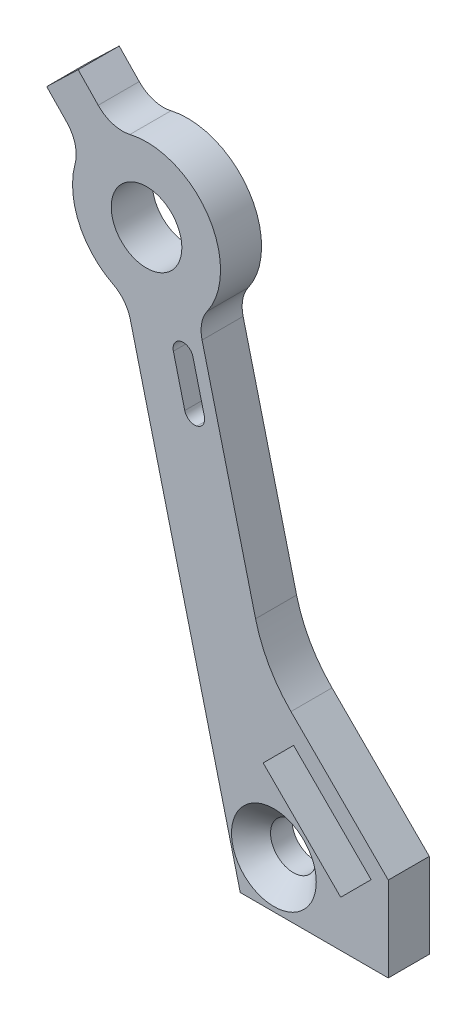
ISO-10303-21;
HEADER;
FILE_DESCRIPTION(('STEP AP214'),'2;1');
FILE_NAME('part.step','',(''),(''),'','','');
FILE_SCHEMA(('AUTOMOTIVE_DESIGN { 1 0 10303 214 1 1 1 1 }'));
ENDSEC;
DATA;
#1=APPLICATION_CONTEXT('core data for automotive mechanical design processes');
#2=APPLICATION_PROTOCOL_DEFINITION('international standard','automotive_design',2000,#1);
#3=PRODUCT_CONTEXT('',#1,'mechanical');
#4=PRODUCT('Part','Part','',(#3));
#5=PRODUCT_RELATED_PRODUCT_CATEGORY('part','',(#4));
#6=PRODUCT_DEFINITION_FORMATION('','',#4);
#7=PRODUCT_DEFINITION_CONTEXT('part definition',#1,'design');
#8=PRODUCT_DEFINITION('design','',#6,#7);
#9=PRODUCT_DEFINITION_SHAPE('','',#8);
#10=(LENGTH_UNIT() NAMED_UNIT(*) SI_UNIT(.MILLI.,.METRE.));
#11=(NAMED_UNIT(*) PLANE_ANGLE_UNIT() SI_UNIT($,.RADIAN.));
#12=(NAMED_UNIT(*) SI_UNIT($,.STERADIAN.) SOLID_ANGLE_UNIT());
#13=UNCERTAINTY_MEASURE_WITH_UNIT(LENGTH_MEASURE(1.E-05),#10,'distance_accuracy_value','');
#14=(GEOMETRIC_REPRESENTATION_CONTEXT(3) GLOBAL_UNCERTAINTY_ASSIGNED_CONTEXT((#13)) GLOBAL_UNIT_ASSIGNED_CONTEXT((#10,
#11,#12)) REPRESENTATION_CONTEXT('',''));
#15=CARTESIAN_POINT('',(0.,0.,0.));
#16=DIRECTION('',(0.,0.,1.));
#17=DIRECTION('',(1.,0.,0.));
#18=AXIS2_PLACEMENT_3D('',#15,#16,#17);
#19=CARTESIAN_POINT('',(4.36654034065617,1.08780763622181,3.05));
#20=DIRECTION('',(-0.970342297923589,-0.241735030271512,0.));
#21=DIRECTION('',(0.241735030271512,-0.970342297923589,0.));
#22=AXIS2_PLACEMENT_3D('',#19,#20,#21);
#23=PLANE('',#22);
#24=DIRECTION('',(-0.241735030271512,0.970342297923589,0.));
#25=VECTOR('',#24,1.);
#26=CARTESIAN_POINT('',(4.36654034065617,1.08780763622181,0.));
#27=LINE('',#26,#25);
#28=CARTESIAN_POINT('',(-2.66788839228542,29.3245250604018,0.));
#29=VERTEX_POINT('',#28);
#30=CARTESIAN_POINT('',(-3.51396099823572,32.7207231031344,0.));
#31=VERTEX_POINT('',#30);
#32=EDGE_CURVE('E345',#29,#31,#27,.T.);
#33=ORIENTED_EDGE('',*,*,#32,.F.);
#34=DIRECTION('',(0.,0.,-1.));
#35=VECTOR('',#34,1.);
#36=CARTESIAN_POINT('',(-2.66788839228542,29.3245250604018,3.05));
#37=LINE('',#36,#35);
#38=CARTESIAN_POINT('',(-2.66788839228542,29.3245250604018,3.05));
#39=VERTEX_POINT('',#38);
#40=EDGE_CURVE('E444',#29,#39,#37,.F.);
#41=ORIENTED_EDGE('',*,*,#40,.T.);
#42=DIRECTION('',(-0.241735030271512,0.970342297923589,0.));
#43=VECTOR('',#42,1.);
#44=CARTESIAN_POINT('',(4.36654034065617,1.08780763622181,3.05));
#45=LINE('',#44,#43);
#46=CARTESIAN_POINT('',(-3.51396099823572,32.7207231031344,3.05));
#47=VERTEX_POINT('',#46);
#48=EDGE_CURVE('E284',#39,#47,#45,.T.);
#49=ORIENTED_EDGE('',*,*,#48,.T.);
#50=DIRECTION('',(0.,0.,-1.));
#51=VECTOR('',#50,1.);
#52=CARTESIAN_POINT('',(-3.51396099823572,32.7207231031344,0.));
#53=LINE('',#52,#51);
#54=EDGE_CURVE('E440',#47,#31,#53,.T.);
#55=ORIENTED_EDGE('',*,*,#54,.T.);
#56=EDGE_LOOP('',(#33,#41,#49,#55));
#57=FACE_BOUND('',#56,.T.);
#58=ADVANCED_FACE('F45',(#57),#23,.T.);
#59=CARTESIAN_POINT('',(7.70970869120796,7.70970869120796,3.05));
#60=DIRECTION('',(0.707106781186548,0.707106781186547,0.));
#61=DIRECTION('',(-0.707106781186547,0.707106781186548,0.));
#62=AXIS2_PLACEMENT_3D('',#59,#60,#61);
#63=PLANE('',#62);
#64=DIRECTION('',(0.707106781186547,-0.707106781186548,0.));
#65=VECTOR('',#64,1.);
#66=CARTESIAN_POINT('',(7.70970869120796,7.70970869120796,0.));
#67=LINE('',#66,#65);
#68=CARTESIAN_POINT('',(3.96428752719385,11.4551298552221,0.));
#69=VERTEX_POINT('',#68);
#70=CARTESIAN_POINT('',(9.72720779386421,5.6922095885517,0.));
#71=VERTEX_POINT('',#70);
#72=EDGE_CURVE('E331',#69,#71,#67,.T.);
#73=ORIENTED_EDGE('',*,*,#72,.T.);
#74=DIRECTION('',(0.,0.,-1.));
#75=VECTOR('',#74,1.);
#76=CARTESIAN_POINT('',(9.72720779386421,5.6922095885517,3.05));
#77=LINE('',#76,#75);
#78=CARTESIAN_POINT('',(9.72720779386421,5.6922095885517,3.05));
#79=VERTEX_POINT('',#78);
#80=EDGE_CURVE('E363',#79,#71,#77,.T.);
#81=ORIENTED_EDGE('',*,*,#80,.F.);
#82=DIRECTION('',(0.707106781186547,-0.707106781186548,0.));
#83=VECTOR('',#82,1.);
#84=CARTESIAN_POINT('',(7.70970869120796,7.70970869120796,3.05));
#85=LINE('',#84,#83);
#86=CARTESIAN_POINT('',(3.96428752719385,11.4551298552221,3.05));
#87=VERTEX_POINT('',#86);
#88=EDGE_CURVE('E271',#87,#79,#85,.T.);
#89=ORIENTED_EDGE('',*,*,#88,.F.);
#90=DIRECTION('',(0.,0.,-1.));
#91=VECTOR('',#90,1.);
#92=CARTESIAN_POINT('',(3.96428752719385,11.4551298552221,3.05));
#93=LINE('',#92,#91);
#94=EDGE_CURVE('E227',#87,#69,#93,.T.);
#95=ORIENTED_EDGE('',*,*,#94,.T.);
#96=EDGE_LOOP('',(#73,#81,#89,#95));
#97=FACE_BOUND('',#96,.T.);
#98=ADVANCED_FACE('F521',(#97),#63,.F.);
#99=CARTESIAN_POINT('',(2.01749910265625,-2.01749910265625,3.05));
#100=DIRECTION('',(-0.707106781186547,0.707106781186548,0.));
#101=DIRECTION('',(-0.707106781186548,-0.707106781186547,0.));
#102=AXIS2_PLACEMENT_3D('',#99,#100,#101);
#103=PLANE('',#102);
#104=DIRECTION('',(0.707106781186548,0.707106781186547,0.));
#105=VECTOR('',#104,1.);
#106=CARTESIAN_POINT('',(2.01749910265625,-2.01749910265625,0.));
#107=LINE('',#106,#105);
#108=CARTESIAN_POINT('',(7.46446609406726,3.42946788875475,0.));
#109=VERTEX_POINT('',#108);
#110=EDGE_CURVE('E335',#109,#71,#107,.T.);
#111=ORIENTED_EDGE('',*,*,#110,.F.);
#112=DIRECTION('',(0.,0.,-1.));
#113=VECTOR('',#112,1.);
#114=CARTESIAN_POINT('',(7.46446609406726,3.42946788875475,3.05));
#115=LINE('',#114,#113);
#116=CARTESIAN_POINT('',(7.46446609406726,3.42946788875475,3.05));
#117=VERTEX_POINT('',#116);
#118=EDGE_CURVE('E360',#117,#109,#115,.T.);
#119=ORIENTED_EDGE('',*,*,#118,.F.);
#120=DIRECTION('',(0.707106781186548,0.707106781186547,0.));
#121=VECTOR('',#120,1.);
#122=CARTESIAN_POINT('',(2.01749910265625,-2.01749910265625,3.05));
#123=LINE('',#122,#121);
#124=EDGE_CURVE('E274',#117,#79,#123,.T.);
#125=ORIENTED_EDGE('',*,*,#124,.T.);
#126=ORIENTED_EDGE('',*,*,#80,.T.);
#127=EDGE_LOOP('',(#111,#119,#125,#126));
#128=FACE_BOUND('',#127,.T.);
#129=ADVANCED_FACE('F526',(#128),#103,.T.);
#130=CARTESIAN_POINT('',(5.44696699141101,5.44696699141101,3.05));
#131=DIRECTION('',(-0.707106781186548,-0.707106781186548,0.));
#132=DIRECTION('',(0.707106781186548,-0.707106781186548,0.));
#133=AXIS2_PLACEMENT_3D('',#130,#131,#132);
#134=PLANE('',#133);
#135=DIRECTION('',(-0.707106781186548,0.707106781186548,0.));
#136=VECTOR('',#135,1.);
#137=CARTESIAN_POINT('',(5.44696699141101,5.44696699141101,0.));
#138=LINE('',#137,#136);
#139=CARTESIAN_POINT('',(1.70154582739689,9.19238815542512,0.));
#140=VERTEX_POINT('',#139);
#141=EDGE_CURVE('E339',#109,#140,#138,.T.);
#142=ORIENTED_EDGE('',*,*,#141,.T.);
#143=DIRECTION('',(0.,0.,-1.));
#144=VECTOR('',#143,1.);
#145=CARTESIAN_POINT('',(1.70154582739689,9.19238815542512,3.05));
#146=LINE('',#145,#144);
#147=CARTESIAN_POINT('',(1.70154582739689,9.19238815542512,3.05));
#148=VERTEX_POINT('',#147);
#149=EDGE_CURVE('E356',#148,#140,#146,.T.);
#150=ORIENTED_EDGE('',*,*,#149,.F.);
#151=DIRECTION('',(-0.707106781186548,0.707106781186548,0.));
#152=VECTOR('',#151,1.);
#153=CARTESIAN_POINT('',(5.44696699141101,5.44696699141101,3.05));
#154=LINE('',#153,#152);
#155=EDGE_CURVE('E278',#117,#148,#154,.T.);
#156=ORIENTED_EDGE('',*,*,#155,.F.);
#157=ORIENTED_EDGE('',*,*,#118,.T.);
#158=EDGE_LOOP('',(#142,#150,#156,#157));
#159=FACE_BOUND('',#158,.T.);
#160=ADVANCED_FACE('F536',(#159),#134,.F.);
#161=CARTESIAN_POINT('',(-6.96463898907044,39.3326684601052,3.05));
#162=DIRECTION('',(0.,0.,-1.));
#163=DIRECTION('',(-1.,0.,0.));
#164=AXIS2_PLACEMENT_3D('',#161,#162,#163);
#165=CYLINDRICAL_SURFACE('',#164,5.5);
#166=CARTESIAN_POINT('',(-6.96463898907044,39.3326684601052,0.));
#167=DIRECTION('',(0.,0.,1.));
#168=DIRECTION('',(1.,0.,0.));
#169=AXIS2_PLACEMENT_3D('',#166,#167,#168);
#170=CIRCLE('',#169,5.5);
#171=CARTESIAN_POINT('',(-2.45911194166731,36.1782705738013,0.));
#172=VERTEX_POINT('',#171);
#173=CARTESIAN_POINT('',(-8.19716703361366,44.6927873598513,0.));
#174=VERTEX_POINT('',#173);
#175=EDGE_CURVE('E297',#172,#174,#170,.T.);
#176=ORIENTED_EDGE('',*,*,#175,.T.);
#177=DIRECTION('',(0.,0.,-1.));
#178=VECTOR('',#177,1.);
#179=CARTESIAN_POINT('',(-8.19716703361366,44.6927873598513,3.05));
#180=LINE('',#179,#178);
#181=CARTESIAN_POINT('',(-8.19716703361366,44.6927873598513,3.05));
#182=VERTEX_POINT('',#181);
#183=EDGE_CURVE('E384',#174,#182,#180,.F.);
#184=ORIENTED_EDGE('',*,*,#183,.T.);
#185=CARTESIAN_POINT('',(-6.96463898907044,39.3326684601052,3.05));
#186=DIRECTION('',(0.,0.,1.));
#187=DIRECTION('',(1.,0.,0.));
#188=AXIS2_PLACEMENT_3D('',#185,#186,#187);
#189=CIRCLE('',#188,5.5);
#190=CARTESIAN_POINT('',(-2.45911194166731,36.1782705738013,3.05));
#191=VERTEX_POINT('',#190);
#192=EDGE_CURVE('E241',#191,#182,#189,.T.);
#193=ORIENTED_EDGE('',*,*,#192,.F.);
#194=DIRECTION('',(0.,0.,-1.));
#195=VECTOR('',#194,1.);
#196=CARTESIAN_POINT('',(-2.45911194166731,36.1782705738013,3.05));
#197=LINE('',#196,#195);
#198=EDGE_CURVE('E380',#191,#172,#197,.T.);
#199=ORIENTED_EDGE('',*,*,#198,.T.);
#200=EDGE_LOOP('',(#176,#184,#193,#199));
#201=FACE_BOUND('',#200,.T.);
#202=ADVANCED_FACE('F539',(#201),#165,.T.);
#203=CARTESIAN_POINT('',(17.2180416361221,16.6208626165362,3.05));
#204=DIRECTION('',(0.719473565232645,0.694519826161519,0.));
#205=DIRECTION('',(-0.694519826161519,0.719473565232645,0.));
#206=AXIS2_PLACEMENT_3D('',#203,#204,#205);
#207=PLANE('',#206);
#208=DIRECTION('',(0.694519826161519,-0.719473565232645,0.));
#209=VECTOR('',#208,1.);
#210=CARTESIAN_POINT('',(17.2180416361221,16.6208626165362,3.05));
#211=LINE('',#210,#209);
#212=CARTESIAN_POINT('',(-12.0461728810211,46.9365252647115,3.05));
#213=VERTEX_POINT('',#212);
#214=CARTESIAN_POINT('',(-10.5560909669422,45.3929054761502,3.05));
#215=VERTEX_POINT('',#214);
#216=EDGE_CURVE('E218',#213,#215,#211,.T.);
#217=ORIENTED_EDGE('',*,*,#216,.T.);
#218=DIRECTION('',(0.,0.,-1.));
#219=VECTOR('',#218,1.);
#220=CARTESIAN_POINT('',(-10.5560909669422,45.3929054761502,3.05));
#221=LINE('',#220,#219);
#222=CARTESIAN_POINT('',(-10.5560909669422,45.3929054761502,0.));
#223=VERTEX_POINT('',#222);
#224=EDGE_CURVE('E366',#215,#223,#221,.T.);
#225=ORIENTED_EDGE('',*,*,#224,.T.);
#226=DIRECTION('',(0.694519826161519,-0.719473565232645,0.));
#227=VECTOR('',#226,1.);
#228=CARTESIAN_POINT('',(17.2180416361221,16.6208626165362,0.));
#229=LINE('',#228,#227);
#230=CARTESIAN_POINT('',(-12.0461728810211,46.9365252647115,0.));
#231=VERTEX_POINT('',#230);
#232=EDGE_CURVE('E221',#231,#223,#229,.T.);
#233=ORIENTED_EDGE('',*,*,#232,.F.);
#234=DIRECTION('',(0.,0.,-1.));
#235=VECTOR('',#234,1.);
#236=CARTESIAN_POINT('',(-12.0461728810211,46.9365252647115,3.05));
#237=LINE('',#236,#235);
#238=EDGE_CURVE('E214',#213,#231,#237,.T.);
#239=ORIENTED_EDGE('',*,*,#238,.F.);
#240=EDGE_LOOP('',(#217,#225,#233,#239));
#241=FACE_BOUND('',#240,.T.);
#242=ADVANCED_FACE('F216',(#241),#207,.T.);
#243=CARTESIAN_POINT('',(-29.2642145171432,30.3156626481751,3.05));
#244=DIRECTION('',(-0.694519826161522,0.719473565232643,0.));
#245=DIRECTION('',(-0.719473565232643,-0.694519826161522,0.));
#246=AXIS2_PLACEMENT_3D('',#243,#244,#245);
#247=PLANE('',#246);
#248=DIRECTION('',(0.719473565232643,0.694519826161522,0.));
#249=VECTOR('',#248,1.);
#250=CARTESIAN_POINT('',(-29.2642145171432,30.3156626481751,0.));
#251=LINE('',#250,#249);
#252=CARTESIAN_POINT('',(-14.3844619680272,44.6793358296865,0.));
#253=VERTEX_POINT('',#252);
#254=EDGE_CURVE('E307',#253,#231,#251,.T.);
#255=ORIENTED_EDGE('',*,*,#254,.F.);
#256=DIRECTION('',(0.,0.,-1.));
#257=VECTOR('',#256,1.);
#258=CARTESIAN_POINT('',(-14.3844619680272,44.6793358296865,3.05));
#259=LINE('',#258,#257);
#260=CARTESIAN_POINT('',(-14.3844619680272,44.6793358296865,3.05));
#261=VERTEX_POINT('',#260);
#262=EDGE_CURVE('E228',#261,#253,#259,.T.);
#263=ORIENTED_EDGE('',*,*,#262,.F.);
#264=DIRECTION('',(0.719473565232643,0.694519826161522,0.));
#265=VECTOR('',#264,1.);
#266=CARTESIAN_POINT('',(-29.2642145171432,30.3156626481751,3.05));
#267=LINE('',#266,#265);
#268=EDGE_CURVE('E236',#261,#213,#267,.T.);
#269=ORIENTED_EDGE('',*,*,#268,.T.);
#270=ORIENTED_EDGE('',*,*,#238,.T.);
#271=EDGE_LOOP('',(#255,#263,#269,#270));
#272=FACE_BOUND('',#271,.T.);
#273=ADVANCED_FACE('F243',(#272),#247,.T.);
#274=CARTESIAN_POINT('',(14.8797525491159,14.3636731815112,3.05));
#275=DIRECTION('',(0.719473565232646,0.694519826161518,0.));
#276=DIRECTION('',(-0.694519826161518,0.719473565232646,0.));
#277=AXIS2_PLACEMENT_3D('',#274,#275,#276);
#278=PLANE('',#277);
#279=DIRECTION('',(0.694519826161518,-0.719473565232647,0.));
#280=VECTOR('',#279,1.);
#281=CARTESIAN_POINT('',(14.8797525491159,14.3636731815112,0.));
#282=LINE('',#281,#280);
#283=CARTESIAN_POINT('',(-12.8943800539482,43.1357160411252,0.));
#284=VERTEX_POINT('',#283);
#285=EDGE_CURVE('E304',#253,#284,#282,.T.);
#286=ORIENTED_EDGE('',*,*,#285,.T.);
#287=DIRECTION('',(0.,0.,1.));
#288=VECTOR('',#287,1.);
#289=CARTESIAN_POINT('',(-12.8943800539482,43.1357160411252,3.05));
#290=LINE('',#289,#288);
#291=CARTESIAN_POINT('',(-12.8943800539482,43.1357160411252,3.05));
#292=VERTEX_POINT('',#291);
#293=EDGE_CURVE('E394',#284,#292,#290,.T.);
#294=ORIENTED_EDGE('',*,*,#293,.T.);
#295=DIRECTION('',(0.694519826161518,-0.719473565232647,0.));
#296=VECTOR('',#295,1.);
#297=CARTESIAN_POINT('',(14.8797525491159,14.3636731815112,3.05));
#298=LINE('',#297,#296);
#299=EDGE_CURVE('E246',#261,#292,#298,.T.);
#300=ORIENTED_EDGE('',*,*,#299,.F.);
#301=ORIENTED_EDGE('',*,*,#262,.T.);
#302=EDGE_LOOP('',(#286,#294,#300,#301));
#303=FACE_BOUND('',#302,.T.);
#304=ADVANCED_FACE('F565',(#303),#278,.F.);
#305=CARTESIAN_POINT('',(-12.2779311614175,40.7535577208413,3.05));
#306=VERTEX_POINT('',#305);
#307=CARTESIAN_POINT('',(-9.4637704048032,34.4332458240289,3.05));
#308=VERTEX_POINT('',#307);
#309=EDGE_CURVE('E249',#306,#308,#189,.T.);
#310=ORIENTED_EDGE('',*,*,#309,.F.);
#311=DIRECTION('',(0.,0.,-1.));
#312=VECTOR('',#311,1.);
#313=CARTESIAN_POINT('',(-12.2779311614175,40.7535577208413,3.05));
#314=LINE('',#313,#312);
#315=CARTESIAN_POINT('',(-12.2779311614175,40.7535577208413,0.));
#316=VERTEX_POINT('',#315);
#317=EDGE_CURVE('E390',#306,#316,#314,.T.);
#318=ORIENTED_EDGE('',*,*,#317,.T.);
#319=CARTESIAN_POINT('',(-9.4637704048032,34.4332458240289,0.));
#320=VERTEX_POINT('',#319);
#321=EDGE_CURVE('E299',#316,#320,#170,.T.);
#322=ORIENTED_EDGE('',*,*,#321,.T.);
#323=DIRECTION('',(0.,0.,-1.));
#324=VECTOR('',#323,1.);
#325=CARTESIAN_POINT('',(-9.4637704048032,34.4332458240289,3.05));
#326=LINE('',#325,#324);
#327=EDGE_CURVE('E387',#320,#308,#326,.F.);
#328=ORIENTED_EDGE('',*,*,#327,.T.);
#329=EDGE_LOOP('',(#310,#318,#322,#328));
#330=FACE_BOUND('',#329,.T.);
#331=ADVANCED_FACE('F561',(#330),#165,.T.);
#332=CARTESIAN_POINT('',(0.,0.,3.05));
#333=DIRECTION('',(-0.970342297923589,-0.241735030271511,0.));
#334=DIRECTION('',(0.241735030271511,-0.970342297923589,0.));
#335=AXIS2_PLACEMENT_3D('',#332,#333,#334);
#336=PLANE('',#335);
#337=DIRECTION('',(-0.241735030271511,0.970342297923589,0.));
#338=VECTOR('',#337,1.);
#339=CARTESIAN_POINT('',(0.,0.,3.05));
#340=LINE('',#339,#338);
#341=CARTESIAN_POINT('',(0.,0.,3.05));
#342=VERTEX_POINT('',#341);
#343=CARTESIAN_POINT('',(-8.17388348532729,32.810573110582,3.05));
#344=VERTEX_POINT('',#343);
#345=EDGE_CURVE('E253',#342,#344,#340,.T.);
#346=ORIENTED_EDGE('',*,*,#345,.T.);
#347=DIRECTION('',(0.,0.,-1.));
#348=VECTOR('',#347,1.);
#349=CARTESIAN_POINT('',(-8.17388348532729,32.810573110582,3.05));
#350=LINE('',#349,#348);
#351=CARTESIAN_POINT('',(-8.17388348532729,32.810573110582,0.));
#352=VERTEX_POINT('',#351);
#353=EDGE_CURVE('E397',#344,#352,#350,.T.);
#354=ORIENTED_EDGE('',*,*,#353,.T.);
#355=DIRECTION('',(-0.241735030271511,0.970342297923589,0.));
#356=VECTOR('',#355,1.);
#357=CARTESIAN_POINT('',(0.,0.,0.));
#358=LINE('',#357,#356);
#359=CARTESIAN_POINT('',(0.,0.,0.));
#360=VERTEX_POINT('',#359);
#361=EDGE_CURVE('E303',#360,#352,#358,.T.);
#362=ORIENTED_EDGE('',*,*,#361,.F.);
#363=DIRECTION('',(0.,0.,-1.));
#364=VECTOR('',#363,1.);
#365=CARTESIAN_POINT('',(0.,0.,3.05));
#366=LINE('',#365,#364);
#367=EDGE_CURVE('E373',#342,#360,#366,.T.);
#368=ORIENTED_EDGE('',*,*,#367,.F.);
#369=EDGE_LOOP('',(#346,#354,#362,#368));
#370=FACE_BOUND('',#369,.T.);
#371=ADVANCED_FACE('F557',(#370),#336,.T.);
#372=CARTESIAN_POINT('',(0.,0.,3.05));
#373=DIRECTION('',(0.,1.,0.));
#374=DIRECTION('',(-1.,0.,0.));
#375=AXIS2_PLACEMENT_3D('',#372,#373,#374);
#376=PLANE('',#375);
#377=DIRECTION('',(1.,0.,0.));
#378=VECTOR('',#377,1.);
#379=CARTESIAN_POINT('',(0.,0.,0.));
#380=LINE('',#379,#378);
#381=CARTESIAN_POINT('',(11.,0.,0.));
#382=VERTEX_POINT('',#381);
#383=EDGE_CURVE('E316',#360,#382,#380,.T.);
#384=ORIENTED_EDGE('',*,*,#383,.T.);
#385=DIRECTION('',(0.,0.,-1.));
#386=VECTOR('',#385,1.);
#387=CARTESIAN_POINT('',(11.,0.,3.05));
#388=LINE('',#387,#386);
#389=CARTESIAN_POINT('',(11.,0.,3.05));
#390=VERTEX_POINT('',#389);
#391=EDGE_CURVE('E370',#390,#382,#388,.T.);
#392=ORIENTED_EDGE('',*,*,#391,.F.);
#393=DIRECTION('',(1.,0.,0.));
#394=VECTOR('',#393,1.);
#395=CARTESIAN_POINT('',(0.,0.,3.05));
#396=LINE('',#395,#394);
#397=EDGE_CURVE('E257',#342,#390,#396,.T.);
#398=ORIENTED_EDGE('',*,*,#397,.F.);
#399=ORIENTED_EDGE('',*,*,#367,.T.);
#400=EDGE_LOOP('',(#384,#392,#398,#399));
#401=FACE_BOUND('',#400,.T.);
#402=ADVANCED_FACE('F553',(#401),#376,.F.);
#403=CARTESIAN_POINT('',(11.,0.,3.05));
#404=DIRECTION('',(1.,0.,0.));
#405=DIRECTION('',(0.,0.,-1.));
#406=AXIS2_PLACEMENT_3D('',#403,#404,#405);
#407=PLANE('',#406);
#408=DIRECTION('',(0.,-1.,0.));
#409=VECTOR('',#408,1.);
#410=CARTESIAN_POINT('',(11.,0.,0.));
#411=LINE('',#410,#409);
#412=CARTESIAN_POINT('',(11.,6.30390861535611,0.));
#413=VERTEX_POINT('',#412);
#414=EDGE_CURVE('E320',#413,#382,#411,.T.);
#415=ORIENTED_EDGE('',*,*,#414,.F.);
#416=DIRECTION('',(0.,0.,-1.));
#417=VECTOR('',#416,1.);
#418=CARTESIAN_POINT('',(11.,6.30390861535611,3.05));
#419=LINE('',#418,#417);
#420=CARTESIAN_POINT('',(11.,6.30390861535611,3.05));
#421=VERTEX_POINT('',#420);
#422=EDGE_CURVE('E292',#421,#413,#419,.T.);
#423=ORIENTED_EDGE('',*,*,#422,.F.);
#424=DIRECTION('',(0.,-1.,0.));
#425=VECTOR('',#424,1.);
#426=CARTESIAN_POINT('',(11.,0.,3.05));
#427=LINE('',#426,#425);
#428=EDGE_CURVE('E260',#421,#390,#427,.T.);
#429=ORIENTED_EDGE('',*,*,#428,.T.);
#430=ORIENTED_EDGE('',*,*,#391,.T.);
#431=EDGE_LOOP('',(#415,#423,#429,#430));
#432=FACE_BOUND('',#431,.T.);
#433=ADVANCED_FACE('F549',(#432),#407,.T.);
#434=CARTESIAN_POINT('',(8.65195430767805,8.65195430767805,3.05));
#435=DIRECTION('',(0.707106781186547,0.707106781186548,0.));
#436=DIRECTION('',(-0.707106781186548,0.707106781186547,0.));
#437=AXIS2_PLACEMENT_3D('',#434,#435,#436);
#438=PLANE('',#437);
#439=DIRECTION('',(0.707106781186548,-0.707106781186547,0.));
#440=VECTOR('',#439,1.);
#441=CARTESIAN_POINT('',(8.65195430767805,8.65195430767805,0.));
#442=LINE('',#441,#440);
#443=CARTESIAN_POINT('',(3.76932576449459,13.5345828508615,0.));
#444=VERTEX_POINT('',#443);
#445=EDGE_CURVE('E324',#444,#413,#442,.T.);
#446=ORIENTED_EDGE('',*,*,#445,.F.);
#447=DIRECTION('',(0.,0.,-1.));
#448=VECTOR('',#447,1.);
#449=CARTESIAN_POINT('',(3.76932576449459,13.5345828508615,3.05));
#450=LINE('',#449,#448);
#451=CARTESIAN_POINT('',(3.76932576449459,13.5345828508615,3.05));
#452=VERTEX_POINT('',#451);
#453=EDGE_CURVE('E431',#444,#452,#450,.F.);
#454=ORIENTED_EDGE('',*,*,#453,.T.);
#455=DIRECTION('',(0.707106781186548,-0.707106781186547,0.));
#456=VECTOR('',#455,1.);
#457=CARTESIAN_POINT('',(8.65195430767805,8.65195430767805,3.05));
#458=LINE('',#457,#456);
#459=EDGE_CURVE('E264',#452,#421,#458,.T.);
#460=ORIENTED_EDGE('',*,*,#459,.T.);
#461=ORIENTED_EDGE('',*,*,#422,.T.);
#462=EDGE_LOOP('',(#446,#454,#460,#461));
#463=FACE_BOUND('',#462,.T.);
#464=ADVANCED_FACE('F534',(#463),#438,.T.);
#465=CARTESIAN_POINT('',(-3.74542116401411,3.74542116401412,3.05));
#466=DIRECTION('',(-0.707106781186547,0.707106781186548,0.));
#467=DIRECTION('',(-0.707106781186548,-0.707106781186547,0.));
#468=AXIS2_PLACEMENT_3D('',#465,#466,#467);
#469=PLANE('',#468);
#470=DIRECTION('',(0.707106781186548,0.707106781186547,0.));
#471=VECTOR('',#470,1.);
#472=CARTESIAN_POINT('',(-3.74542116401411,3.74542116401412,0.));
#473=LINE('',#472,#471);
#474=EDGE_CURVE('E342',#140,#69,#473,.T.);
#475=ORIENTED_EDGE('',*,*,#474,.T.);
#476=ORIENTED_EDGE('',*,*,#94,.F.);
#477=DIRECTION('',(0.707106781186548,0.707106781186547,0.));
#478=VECTOR('',#477,1.);
#479=CARTESIAN_POINT('',(-3.74542116401411,3.74542116401412,3.05));
#480=LINE('',#479,#478);
#481=EDGE_CURVE('E281',#148,#87,#480,.T.);
#482=ORIENTED_EDGE('',*,*,#481,.F.);
#483=ORIENTED_EDGE('',*,*,#149,.T.);
#484=EDGE_LOOP('',(#475,#476,#482,#483));
#485=FACE_BOUND('',#484,.T.);
#486=ADVANCED_FACE('F530',(#485),#469,.F.);
#487=CARTESIAN_POINT('',(5.33688263857945,1.32954266649319,3.05));
#488=DIRECTION('',(0.970342297923591,0.241735030271503,0.));
#489=DIRECTION('',(-0.241735030271503,0.970342297923591,0.));
#490=AXIS2_PLACEMENT_3D('',#487,#488,#489);
#491=PLANE('',#490);
#492=DIRECTION('',(0.241735030271503,-0.970342297923591,0.));
#493=VECTOR('',#492,1.);
#494=CARTESIAN_POINT('',(5.33688263857945,1.32954266649319,3.05));
#495=LINE('',#494,#493);
#496=CARTESIAN_POINT('',(-2.8370008467476,34.1401157770753,3.05));
#497=VERTEX_POINT('',#496);
#498=CARTESIAN_POINT('',(1.13697059712415,18.188300360012,3.05));
#499=VERTEX_POINT('',#498);
#500=EDGE_CURVE('E267',#497,#499,#495,.T.);
#501=ORIENTED_EDGE('',*,*,#500,.T.);
#502=DIRECTION('',(0.,0.,-1.));
#503=VECTOR('',#502,1.);
#504=CARTESIAN_POINT('',(1.13697059712415,18.188300360012,0.));
#505=LINE('',#504,#503);
#506=CARTESIAN_POINT('',(1.13697059712415,18.188300360012,0.));
#507=VERTEX_POINT('',#506);
#508=EDGE_CURVE('E427',#499,#507,#505,.T.);
#509=ORIENTED_EDGE('',*,*,#508,.T.);
#510=DIRECTION('',(0.241735030271503,-0.970342297923591,0.));
#511=VECTOR('',#510,1.);
#512=CARTESIAN_POINT('',(5.33688263857945,1.32954266649319,0.));
#513=LINE('',#512,#511);
#514=CARTESIAN_POINT('',(-2.8370008467476,34.1401157770753,0.));
#515=VERTEX_POINT('',#514);
#516=EDGE_CURVE('E327',#515,#507,#513,.T.);
#517=ORIENTED_EDGE('',*,*,#516,.F.);
#518=DIRECTION('',(0.,0.,-1.));
#519=VECTOR('',#518,1.);
#520=CARTESIAN_POINT('',(-2.83700084674759,34.1401157770753,3.05));
#521=LINE('',#520,#519);
#522=EDGE_CURVE('E401',#515,#497,#521,.F.);
#523=ORIENTED_EDGE('',*,*,#522,.T.);
#524=EDGE_LOOP('',(#501,#509,#517,#523));
#525=FACE_BOUND('',#524,.T.);
#526=ADVANCED_FACE('F533',(#525),#491,.T.);
#527=CARTESIAN_POINT('',(-6.96463898907044,39.3326684601052,3.05));
#528=DIRECTION('',(0.,0.,-1.));
#529=DIRECTION('',(-1.,0.,0.));
#530=AXIS2_PLACEMENT_3D('',#527,#528,#529);
#531=CYLINDRICAL_SURFACE('',#530,2.625);
#532=CARTESIAN_POINT('',(-6.96463898907044,39.3326684601052,3.05));
#533=DIRECTION('',(0.,0.,1.));
#534=DIRECTION('',(1.,0.,0.));
#535=AXIS2_PLACEMENT_3D('',#532,#533,#534);
#536=CIRCLE('',#535,2.625);
#537=CARTESIAN_POINT('',(-4.33963898907044,39.3326684601052,3.05));
#538=VERTEX_POINT('',#537);
#539=EDGE_CURVE('E352',#538,#538,#536,.T.);
#540=ORIENTED_EDGE('',*,*,#539,.T.);
#541=EDGE_LOOP('',(#540));
#542=FACE_BOUND('',#541,.T.);
#543=CARTESIAN_POINT('',(-6.96463898907044,39.3326684601052,0.));
#544=DIRECTION('',(0.,0.,1.));
#545=DIRECTION('',(1.,0.,0.));
#546=AXIS2_PLACEMENT_3D('',#543,#544,#545);
#547=CIRCLE('',#546,2.625);
#548=CARTESIAN_POINT('',(-4.33963898907044,39.3326684601052,0.));
#549=VERTEX_POINT('',#548);
#550=EDGE_CURVE('E293',#549,#549,#547,.T.);
#551=ORIENTED_EDGE('',*,*,#550,.F.);
#552=EDGE_LOOP('',(#551));
#553=FACE_BOUND('',#552,.T.);
#554=ADVANCED_FACE('F515',(#542,#553),#531,.F.);
#555=CARTESIAN_POINT('',(2.91102689377077,0.725205090814533,3.05));
#556=DIRECTION('',(0.970342297923589,0.241735030271511,0.));
#557=DIRECTION('',(-0.241735030271511,0.970342297923589,0.));
#558=AXIS2_PLACEMENT_3D('',#555,#556,#557);
#559=PLANE('',#558);
#560=DIRECTION('',(0.241735030271511,-0.970342297923589,0.));
#561=VECTOR('',#560,1.);
#562=CARTESIAN_POINT('',(2.91102689377077,0.725205090814533,3.05));
#563=LINE('',#562,#561);
#564=CARTESIAN_POINT('',(-4.9694744451211,32.3581205577271,3.05));
#565=VERTEX_POINT('',#564);
#566=CARTESIAN_POINT('',(-4.12340183917081,28.9619225149945,3.05));
#567=VERTEX_POINT('',#566);
#568=EDGE_CURVE('E288',#565,#567,#563,.T.);
#569=ORIENTED_EDGE('',*,*,#568,.T.);
#570=DIRECTION('',(0.,0.,-1.));
#571=VECTOR('',#570,1.);
#572=CARTESIAN_POINT('',(-4.12340183917081,28.9619225149945,0.));
#573=LINE('',#572,#571);
#574=CARTESIAN_POINT('',(-4.12340183917081,28.9619225149945,0.));
#575=VERTEX_POINT('',#574);
#576=EDGE_CURVE('E451',#567,#575,#573,.T.);
#577=ORIENTED_EDGE('',*,*,#576,.T.);
#578=DIRECTION('',(0.241735030271511,-0.970342297923589,0.));
#579=VECTOR('',#578,1.);
#580=CARTESIAN_POINT('',(2.91102689377077,0.725205090814533,0.));
#581=LINE('',#580,#579);
#582=CARTESIAN_POINT('',(-4.9694744451211,32.3581205577271,0.));
#583=VERTEX_POINT('',#582);
#584=EDGE_CURVE('E348',#583,#575,#581,.T.);
#585=ORIENTED_EDGE('',*,*,#584,.F.);
#586=DIRECTION('',(0.,0.,-1.));
#587=VECTOR('',#586,1.);
#588=CARTESIAN_POINT('',(-4.9694744451211,32.3581205577271,3.05));
#589=LINE('',#588,#587);
#590=EDGE_CURVE('E448',#583,#565,#589,.F.);
#591=ORIENTED_EDGE('',*,*,#590,.T.);
#592=EDGE_LOOP('',(#569,#577,#585,#591));
#593=FACE_BOUND('',#592,.T.);
#594=ADVANCED_FACE('F495',(#593),#559,.T.);
#595=CARTESIAN_POINT('',(0.,0.,3.05));
#596=DIRECTION('',(0.,0.,1.));
#597=DIRECTION('',(1.,0.,0.));
#598=AXIS2_PLACEMENT_3D('',#595,#596,#597);
#599=PLANE('',#598);
#600=CARTESIAN_POINT('',(2.5,3.5,3.05));
#601=DIRECTION('',(0.,0.,1.));
#602=DIRECTION('',(1.,0.,0.));
#603=AXIS2_PLACEMENT_3D('',#600,#601,#602);
#604=CIRCLE('',#603,3.15);
#605=CARTESIAN_POINT('',(5.65,3.5,3.05));
#606=VERTEX_POINT('',#605);
#607=EDGE_CURVE('E475',#606,#606,#604,.T.);
#608=ORIENTED_EDGE('',*,*,#607,.F.);
#609=EDGE_LOOP('',(#608));
#610=FACE_BOUND('',#609,.T.);
#611=ORIENTED_EDGE('',*,*,#539,.F.);
#612=EDGE_LOOP('',(#611));
#613=FACE_BOUND('',#612,.T.);
#614=ORIENTED_EDGE('',*,*,#500,.F.);
#615=CARTESIAN_POINT('',(-0.411145101938617,34.7444533527541,3.05));
#616=DIRECTION('',(0.,0.,1.));
#617=DIRECTION('',(1.,0.,0.));
#618=AXIS2_PLACEMENT_3D('',#615,#616,#617);
#619=CIRCLE('',#618,2.5);
#620=EDGE_CURVE('E424',#497,#191,#619,.F.);
#621=ORIENTED_EDGE('',*,*,#620,.T.);
#622=ORIENTED_EDGE('',*,*,#192,.T.);
#623=CARTESIAN_POINT('',(-8.75740705386057,47.129205041554,3.05));
#624=DIRECTION('',(0.,0.,1.));
#625=DIRECTION('',(1.,0.,0.));
#626=AXIS2_PLACEMENT_3D('',#623,#624,#625);
#627=CIRCLE('',#626,2.5);
#628=EDGE_CURVE('E239',#182,#215,#627,.F.);
#629=ORIENTED_EDGE('',*,*,#628,.T.);
#630=ORIENTED_EDGE('',*,*,#216,.F.);
#631=ORIENTED_EDGE('',*,*,#268,.F.);
#632=ORIENTED_EDGE('',*,*,#299,.T.);
#633=CARTESIAN_POINT('',(-14.6930639670298,41.3994164757214,3.05));
#634=DIRECTION('',(0.,0.,1.));
#635=DIRECTION('',(1.,0.,0.));
#636=AXIS2_PLACEMENT_3D('',#633,#634,#635);
#637=CIRCLE('',#636,2.5);
#638=EDGE_CURVE('E412',#292,#306,#637,.F.);
#639=ORIENTED_EDGE('',*,*,#638,.T.);
#640=ORIENTED_EDGE('',*,*,#309,.T.);
#641=CARTESIAN_POINT('',(-10.5997392301363,32.2062355349032,3.05));
#642=DIRECTION('',(0.,0.,1.));
#643=DIRECTION('',(1.,0.,0.));
#644=AXIS2_PLACEMENT_3D('',#641,#642,#643);
#645=CIRCLE('',#644,2.5);
#646=EDGE_CURVE('E418',#308,#344,#645,.F.);
#647=ORIENTED_EDGE('',*,*,#646,.T.);
#648=ORIENTED_EDGE('',*,*,#345,.F.);
#649=ORIENTED_EDGE('',*,*,#397,.T.);
#650=ORIENTED_EDGE('',*,*,#428,.F.);
#651=ORIENTED_EDGE('',*,*,#459,.F.);
#652=CARTESIAN_POINT('',(10.8403935763601,20.605650662727,3.05));
#653=DIRECTION('',(0.,0.,1.));
#654=DIRECTION('',(1.,0.,0.));
#655=AXIS2_PLACEMENT_3D('',#652,#653,#654);
#656=CIRCLE('',#655,10.);
#657=EDGE_CURVE('E437',#452,#499,#656,.F.);
#658=ORIENTED_EDGE('',*,*,#657,.T.);
#659=EDGE_LOOP('',(#614,#621,#622,#629,#630,#631,#632,#639,#640,#647,#648,#649,#650,#651,#658));
#660=FACE_BOUND('',#659,.T.);
#661=ORIENTED_EDGE('',*,*,#88,.T.);
#662=ORIENTED_EDGE('',*,*,#124,.F.);
#663=ORIENTED_EDGE('',*,*,#155,.T.);
#664=ORIENTED_EDGE('',*,*,#481,.T.);
#665=EDGE_LOOP('',(#661,#662,#663,#664));
#666=FACE_BOUND('',#665,.T.);
#667=ORIENTED_EDGE('',*,*,#568,.F.);
#668=CARTESIAN_POINT('',(-4.24171772167841,32.5394218304307,3.05));
#669=DIRECTION('',(0.,0.,1.));
#670=DIRECTION('',(1.,0.,0.));
#671=AXIS2_PLACEMENT_3D('',#668,#669,#670);
#672=CIRCLE('',#671,0.75);
#673=CARTESIAN_POINT('',(-4.42301899438203,33.2671785538734,3.05));
#674=VERTEX_POINT('',#673);
#675=EDGE_CURVE('E11',#565,#674,#672,.F.);
#676=ORIENTED_EDGE('',*,*,#675,.T.);
#677=CARTESIAN_POINT('',(-4.24171772167841,32.5394218304307,3.05));
#678=DIRECTION('',(0.,0.,1.));
#679=DIRECTION('',(1.,0.,0.));
#680=AXIS2_PLACEMENT_3D('',#677,#678,#679);
#681=CIRCLE('',#680,0.75);
#682=EDGE_CURVE('E468',#674,#47,#681,.F.);
#683=ORIENTED_EDGE('',*,*,#682,.T.);
#684=ORIENTED_EDGE('',*,*,#48,.F.);
#685=CARTESIAN_POINT('',(-3.39564511572811,29.1432237876982,3.05));
#686=DIRECTION('',(0.,0.,1.));
#687=DIRECTION('',(1.,0.,0.));
#688=AXIS2_PLACEMENT_3D('',#685,#686,#687);
#689=CIRCLE('',#688,0.75);
#690=CARTESIAN_POINT('',(-3.21434384302448,28.4154670642555,3.05));
#691=VERTEX_POINT('',#690);
#692=EDGE_CURVE('E457',#39,#691,#689,.F.);
#693=ORIENTED_EDGE('',*,*,#692,.T.);
#694=CARTESIAN_POINT('',(-3.39564511572811,29.1432237876982,3.05));
#695=DIRECTION('',(0.,0.,1.));
#696=DIRECTION('',(1.,0.,0.));
#697=AXIS2_PLACEMENT_3D('',#694,#695,#696);
#698=CIRCLE('',#697,0.75);
#699=EDGE_CURVE('E463',#691,#567,#698,.F.);
#700=ORIENTED_EDGE('',*,*,#699,.T.);
#701=EDGE_LOOP('',(#667,#676,#683,#684,#693,#700));
#702=FACE_BOUND('',#701,.T.);
#703=ADVANCED_FACE('F233',(#610,#613,#660,#666,#702),#599,.T.);
#704=CARTESIAN_POINT('',(0.,0.,0.));
#705=DIRECTION('',(0.,0.,1.));
#706=DIRECTION('',(1.,0.,0.));
#707=AXIS2_PLACEMENT_3D('',#704,#705,#706);
#708=PLANE('',#707);
#709=CARTESIAN_POINT('',(2.5,3.5,0.));
#710=DIRECTION('',(0.,0.,1.));
#711=DIRECTION('',(1.,0.,0.));
#712=AXIS2_PLACEMENT_3D('',#709,#710,#711);
#713=CIRCLE('',#712,1.7);
#714=CARTESIAN_POINT('',(4.2,3.5,0.));
#715=VERTEX_POINT('',#714);
#716=EDGE_CURVE('E298',#715,#715,#713,.T.);
#717=ORIENTED_EDGE('',*,*,#716,.T.);
#718=EDGE_LOOP('',(#717));
#719=FACE_BOUND('',#718,.T.);
#720=ORIENTED_EDGE('',*,*,#550,.T.);
#721=EDGE_LOOP('',(#720));
#722=FACE_BOUND('',#721,.T.);
#723=ORIENTED_EDGE('',*,*,#175,.F.);
#724=CARTESIAN_POINT('',(-0.411145101938617,34.7444533527541,0.));
#725=DIRECTION('',(0.,0.,1.));
#726=DIRECTION('',(1.,0.,0.));
#727=AXIS2_PLACEMENT_3D('',#724,#725,#726);
#728=CIRCLE('',#727,2.5);
#729=EDGE_CURVE('E421',#172,#515,#728,.T.);
#730=ORIENTED_EDGE('',*,*,#729,.T.);
#731=ORIENTED_EDGE('',*,*,#516,.T.);
#732=CARTESIAN_POINT('',(10.8403935763601,20.605650662727,0.));
#733=DIRECTION('',(0.,0.,1.));
#734=DIRECTION('',(1.,0.,0.));
#735=AXIS2_PLACEMENT_3D('',#732,#733,#734);
#736=CIRCLE('',#735,10.);
#737=EDGE_CURVE('E434',#507,#444,#736,.T.);
#738=ORIENTED_EDGE('',*,*,#737,.T.);
#739=ORIENTED_EDGE('',*,*,#445,.T.);
#740=ORIENTED_EDGE('',*,*,#414,.T.);
#741=ORIENTED_EDGE('',*,*,#383,.F.);
#742=ORIENTED_EDGE('',*,*,#361,.T.);
#743=CARTESIAN_POINT('',(-10.5997392301363,32.2062355349032,0.));
#744=DIRECTION('',(0.,0.,1.));
#745=DIRECTION('',(1.,0.,0.));
#746=AXIS2_PLACEMENT_3D('',#743,#744,#745);
#747=CIRCLE('',#746,2.5);
#748=EDGE_CURVE('E415',#352,#320,#747,.T.);
#749=ORIENTED_EDGE('',*,*,#748,.T.);
#750=ORIENTED_EDGE('',*,*,#321,.F.);
#751=CARTESIAN_POINT('',(-14.6930639670298,41.3994164757214,0.));
#752=DIRECTION('',(0.,0.,1.));
#753=DIRECTION('',(1.,0.,0.));
#754=AXIS2_PLACEMENT_3D('',#751,#752,#753);
#755=CIRCLE('',#754,2.5);
#756=EDGE_CURVE('E409',#316,#284,#755,.T.);
#757=ORIENTED_EDGE('',*,*,#756,.T.);
#758=ORIENTED_EDGE('',*,*,#285,.F.);
#759=ORIENTED_EDGE('',*,*,#254,.T.);
#760=ORIENTED_EDGE('',*,*,#232,.T.);
#761=CARTESIAN_POINT('',(-8.75740705386057,47.129205041554,0.));
#762=DIRECTION('',(0.,0.,1.));
#763=DIRECTION('',(1.,0.,0.));
#764=AXIS2_PLACEMENT_3D('',#761,#762,#763);
#765=CIRCLE('',#764,2.5);
#766=EDGE_CURVE('E404',#223,#174,#765,.T.);
#767=ORIENTED_EDGE('',*,*,#766,.T.);
#768=EDGE_LOOP('',(#723,#730,#731,#738,#739,#740,#741,#742,#749,#750,#757,#758,#759,#760,#767));
#769=FACE_BOUND('',#768,.T.);
#770=ORIENTED_EDGE('',*,*,#72,.F.);
#771=ORIENTED_EDGE('',*,*,#474,.F.);
#772=ORIENTED_EDGE('',*,*,#141,.F.);
#773=ORIENTED_EDGE('',*,*,#110,.T.);
#774=EDGE_LOOP('',(#770,#771,#772,#773));
#775=FACE_BOUND('',#774,.T.);
#776=CARTESIAN_POINT('',(-4.24171772167841,32.5394218304307,0.));
#777=DIRECTION('',(0.,0.,1.));
#778=DIRECTION('',(1.,0.,0.));
#779=AXIS2_PLACEMENT_3D('',#776,#777,#778);
#780=CIRCLE('',#779,0.75);
#781=CARTESIAN_POINT('',(-4.42301899438203,33.2671785538734,0.));
#782=VERTEX_POINT('',#781);
#783=EDGE_CURVE('E69',#31,#782,#780,.T.);
#784=ORIENTED_EDGE('',*,*,#783,.T.);
#785=CARTESIAN_POINT('',(-4.24171772167841,32.5394218304307,0.));
#786=DIRECTION('',(0.,0.,1.));
#787=DIRECTION('',(1.,0.,0.));
#788=AXIS2_PLACEMENT_3D('',#785,#786,#787);
#789=CIRCLE('',#788,0.75);
#790=EDGE_CURVE('E55',#782,#583,#789,.T.);
#791=ORIENTED_EDGE('',*,*,#790,.T.);
#792=ORIENTED_EDGE('',*,*,#584,.T.);
#793=CARTESIAN_POINT('',(-3.39564511572811,29.1432237876982,0.));
#794=DIRECTION('',(0.,0.,1.));
#795=DIRECTION('',(1.,0.,0.));
#796=AXIS2_PLACEMENT_3D('',#793,#794,#795);
#797=CIRCLE('',#796,0.75);
#798=CARTESIAN_POINT('',(-3.21434384302448,28.4154670642555,0.));
#799=VERTEX_POINT('',#798);
#800=EDGE_CURVE('E460',#575,#799,#797,.T.);
#801=ORIENTED_EDGE('',*,*,#800,.T.);
#802=CARTESIAN_POINT('',(-3.39564511572811,29.1432237876982,0.));
#803=DIRECTION('',(0.,0.,1.));
#804=DIRECTION('',(1.,0.,0.));
#805=AXIS2_PLACEMENT_3D('',#802,#803,#804);
#806=CIRCLE('',#805,0.75);
#807=EDGE_CURVE('E454',#799,#29,#806,.T.);
#808=ORIENTED_EDGE('',*,*,#807,.T.);
#809=ORIENTED_EDGE('',*,*,#32,.T.);
#810=EDGE_LOOP('',(#784,#791,#792,#801,#808,#809));
#811=FACE_BOUND('',#810,.T.);
#812=ADVANCED_FACE('F492',(#719,#722,#769,#775,#811),#708,.F.);
#813=CARTESIAN_POINT('',(2.5,3.5,3.05));
#814=DIRECTION('',(0.,0.,1.));
#815=DIRECTION('',(1.,0.,0.));
#816=AXIS2_PLACEMENT_3D('',#813,#814,#815);
#817=CYLINDRICAL_SURFACE('',#816,1.7);
#818=ORIENTED_EDGE('',*,*,#716,.F.);
#819=EDGE_LOOP('',(#818));
#820=FACE_BOUND('',#819,.T.);
#821=CARTESIAN_POINT('',(2.5,3.5,1.6));
#822=DIRECTION('',(0.,0.,1.));
#823=DIRECTION('',(1.,0.,0.));
#824=AXIS2_PLACEMENT_3D('',#821,#822,#823);
#825=CIRCLE('',#824,1.7);
#826=CARTESIAN_POINT('',(4.2,3.5,1.6));
#827=VERTEX_POINT('',#826);
#828=EDGE_CURVE('E482',#827,#827,#825,.T.);
#829=ORIENTED_EDGE('',*,*,#828,.T.);
#830=EDGE_LOOP('',(#829));
#831=FACE_BOUND('',#830,.T.);
#832=ADVANCED_FACE('F512',(#820,#831),#817,.F.);
#833=CARTESIAN_POINT('',(2.5,3.5,3.05));
#834=DIRECTION('',(0.,0.,1.));
#835=DIRECTION('',(1.,0.,0.));
#836=AXIS2_PLACEMENT_3D('',#833,#834,#835);
#837=CONICAL_SURFACE('',#836,3.15,0.785398163397448);
#838=ORIENTED_EDGE('',*,*,#828,.F.);
#839=EDGE_LOOP('',(#838));
#840=FACE_BOUND('',#839,.T.);
#841=ORIENTED_EDGE('',*,*,#607,.T.);
#842=EDGE_LOOP('',(#841));
#843=FACE_BOUND('',#842,.T.);
#844=ADVANCED_FACE('F581',(#840,#843),#837,.F.);
#845=CARTESIAN_POINT('',(-8.75740705386057,47.129205041554,3.05));
#846=DIRECTION('',(0.,0.,-1.));
#847=DIRECTION('',(-1.,0.,0.));
#848=AXIS2_PLACEMENT_3D('',#845,#846,#847);
#849=CYLINDRICAL_SURFACE('',#848,2.5);
#850=ORIENTED_EDGE('',*,*,#628,.F.);
#851=ORIENTED_EDGE('',*,*,#183,.F.);
#852=ORIENTED_EDGE('',*,*,#766,.F.);
#853=ORIENTED_EDGE('',*,*,#224,.F.);
#854=EDGE_LOOP('',(#850,#851,#852,#853));
#855=FACE_BOUND('',#854,.T.);
#856=ADVANCED_FACE('F577',(#855),#849,.F.);
#857=CARTESIAN_POINT('',(-14.6930639670298,41.3994164757214,3.05));
#858=DIRECTION('',(0.,0.,-1.));
#859=DIRECTION('',(-1.,0.,0.));
#860=AXIS2_PLACEMENT_3D('',#857,#858,#859);
#861=CYLINDRICAL_SURFACE('',#860,2.5);
#862=ORIENTED_EDGE('',*,*,#638,.F.);
#863=ORIENTED_EDGE('',*,*,#293,.F.);
#864=ORIENTED_EDGE('',*,*,#756,.F.);
#865=ORIENTED_EDGE('',*,*,#317,.F.);
#866=EDGE_LOOP('',(#862,#863,#864,#865));
#867=FACE_BOUND('',#866,.T.);
#868=ADVANCED_FACE('F580',(#867),#861,.F.);
#869=CARTESIAN_POINT('',(-10.5997392301363,32.2062355349032,3.05));
#870=DIRECTION('',(0.,0.,-1.));
#871=DIRECTION('',(-1.,0.,0.));
#872=AXIS2_PLACEMENT_3D('',#869,#870,#871);
#873=CYLINDRICAL_SURFACE('',#872,2.5);
#874=ORIENTED_EDGE('',*,*,#646,.F.);
#875=ORIENTED_EDGE('',*,*,#327,.F.);
#876=ORIENTED_EDGE('',*,*,#748,.F.);
#877=ORIENTED_EDGE('',*,*,#353,.F.);
#878=EDGE_LOOP('',(#874,#875,#876,#877));
#879=FACE_BOUND('',#878,.T.);
#880=ADVANCED_FACE('F585',(#879),#873,.F.);
#881=CARTESIAN_POINT('',(-0.411145101938617,34.7444533527541,3.05));
#882=DIRECTION('',(0.,0.,-1.));
#883=DIRECTION('',(-1.,0.,0.));
#884=AXIS2_PLACEMENT_3D('',#881,#882,#883);
#885=CYLINDRICAL_SURFACE('',#884,2.5);
#886=ORIENTED_EDGE('',*,*,#620,.F.);
#887=ORIENTED_EDGE('',*,*,#522,.F.);
#888=ORIENTED_EDGE('',*,*,#729,.F.);
#889=ORIENTED_EDGE('',*,*,#198,.F.);
#890=EDGE_LOOP('',(#886,#887,#888,#889));
#891=FACE_BOUND('',#890,.T.);
#892=ADVANCED_FACE('F589',(#891),#885,.F.);
#893=CARTESIAN_POINT('',(10.8403935763601,20.605650662727,3.05));
#894=DIRECTION('',(0.,0.,1.));
#895=DIRECTION('',(1.,0.,0.));
#896=AXIS2_PLACEMENT_3D('',#893,#894,#895);
#897=CYLINDRICAL_SURFACE('',#896,10.);
#898=ORIENTED_EDGE('',*,*,#657,.F.);
#899=ORIENTED_EDGE('',*,*,#453,.F.);
#900=ORIENTED_EDGE('',*,*,#737,.F.);
#901=ORIENTED_EDGE('',*,*,#508,.F.);
#902=EDGE_LOOP('',(#898,#899,#900,#901));
#903=FACE_BOUND('',#902,.T.);
#904=ADVANCED_FACE('F593',(#903),#897,.F.);
#905=CARTESIAN_POINT('',(-3.39564511572811,29.1432237876982,3.05));
#906=DIRECTION('',(0.,0.,1.));
#907=DIRECTION('',(1.,0.,0.));
#908=AXIS2_PLACEMENT_3D('',#905,#906,#907);
#909=CYLINDRICAL_SURFACE('',#908,0.75);
#910=ORIENTED_EDGE('',*,*,#576,.F.);
#911=ORIENTED_EDGE('',*,*,#699,.F.);
#912=DIRECTION('',(0.,0.,-1.));
#913=VECTOR('',#912,1.);
#914=CARTESIAN_POINT('',(-3.21434384302449,28.4154670642555,3.05));
#915=LINE('',#914,#913);
#916=EDGE_CURVE('E472',#799,#691,#915,.F.);
#917=ORIENTED_EDGE('',*,*,#916,.F.);
#918=ORIENTED_EDGE('',*,*,#800,.F.);
#919=EDGE_LOOP('',(#910,#911,#917,#918));
#920=FACE_BOUND('',#919,.T.);
#921=ADVANCED_FACE('F499',(#920),#909,.F.);
#922=CARTESIAN_POINT('',(-3.39564511572811,29.1432237876982,3.05));
#923=DIRECTION('',(0.,0.,1.));
#924=DIRECTION('',(1.,0.,0.));
#925=AXIS2_PLACEMENT_3D('',#922,#923,#924);
#926=CYLINDRICAL_SURFACE('',#925,0.75);
#927=ORIENTED_EDGE('',*,*,#692,.F.);
#928=ORIENTED_EDGE('',*,*,#40,.F.);
#929=ORIENTED_EDGE('',*,*,#807,.F.);
#930=ORIENTED_EDGE('',*,*,#916,.T.);
#931=EDGE_LOOP('',(#927,#928,#929,#930));
#932=FACE_BOUND('',#931,.T.);
#933=ADVANCED_FACE('F504',(#932),#926,.F.);
#934=CARTESIAN_POINT('',(-4.24171772167841,32.5394218304307,3.05));
#935=DIRECTION('',(0.,0.,1.));
#936=DIRECTION('',(1.,0.,0.));
#937=AXIS2_PLACEMENT_3D('',#934,#935,#936);
#938=CYLINDRICAL_SURFACE('',#937,0.75);
#939=DIRECTION('',(0.,0.,-1.));
#940=VECTOR('',#939,1.);
#941=CARTESIAN_POINT('',(-4.42301899438203,33.2671785538734,0.));
#942=LINE('',#941,#940);
#943=EDGE_CURVE('E49',#674,#782,#942,.T.);
#944=ORIENTED_EDGE('',*,*,#943,.F.);
#945=ORIENTED_EDGE('',*,*,#675,.F.);
#946=ORIENTED_EDGE('',*,*,#590,.F.);
#947=ORIENTED_EDGE('',*,*,#790,.F.);
#948=EDGE_LOOP('',(#944,#945,#946,#947));
#949=FACE_BOUND('',#948,.T.);
#950=ADVANCED_FACE('F47',(#949),#938,.F.);
#951=CARTESIAN_POINT('',(-4.24171772167841,32.5394218304307,3.05));
#952=DIRECTION('',(0.,0.,1.));
#953=DIRECTION('',(1.,0.,0.));
#954=AXIS2_PLACEMENT_3D('',#951,#952,#953);
#955=CYLINDRICAL_SURFACE('',#954,0.75);
#956=ORIENTED_EDGE('',*,*,#682,.F.);
#957=ORIENTED_EDGE('',*,*,#943,.T.);
#958=ORIENTED_EDGE('',*,*,#783,.F.);
#959=ORIENTED_EDGE('',*,*,#54,.F.);
#960=EDGE_LOOP('',(#956,#957,#958,#959));
#961=FACE_BOUND('',#960,.T.);
#962=ADVANCED_FACE('F487',(#961),#955,.F.);
#963=CLOSED_SHELL('',(#58,#98,#129,#160,#202,#242,#273,#304,#331,#371,#402,#433,#464,#486,#526,
#554,#594,#703,#812,#832,#844,#856,#868,#880,#892,#904,#921,#933,#950,#962));
#964=MANIFOLD_SOLID_BREP('B2',#963);
#965=ADVANCED_BREP_SHAPE_REPRESENTATION('',(#18,#964),#14);
#966=SHAPE_DEFINITION_REPRESENTATION(#9,#965);
ENDSEC;
END-ISO-10303-21;
